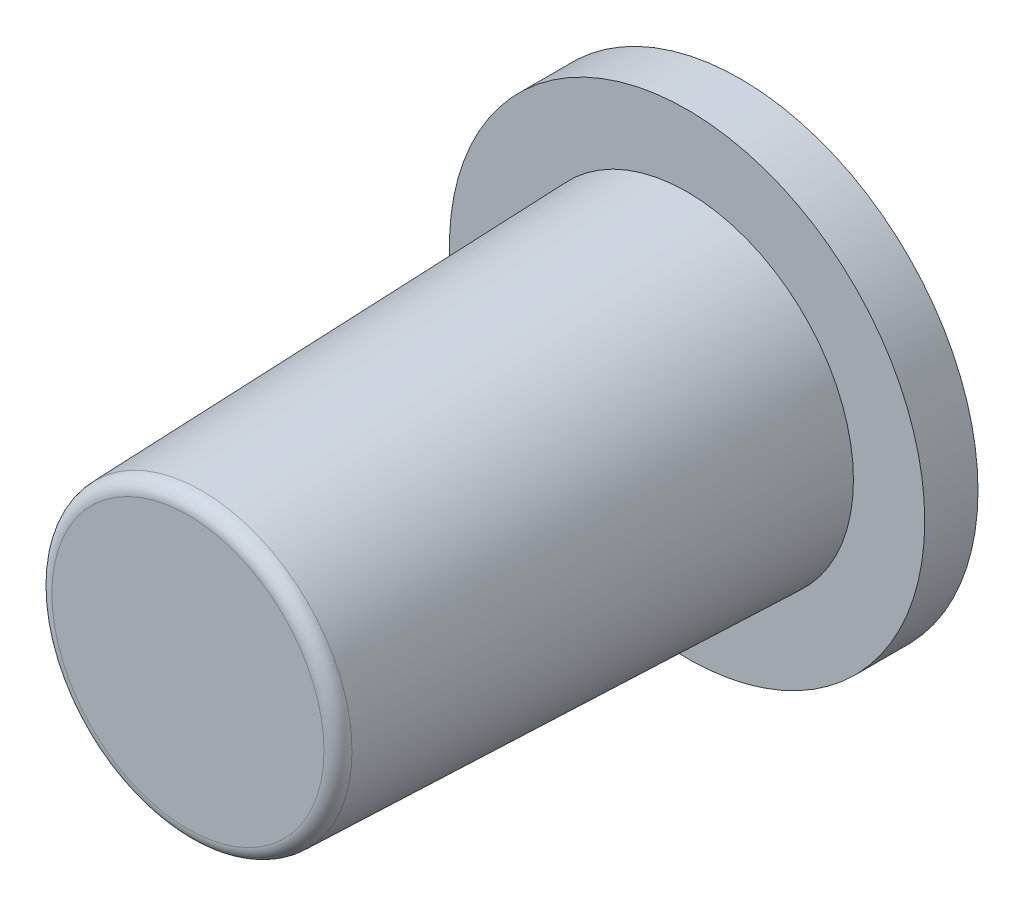
ISO-10303-21;
HEADER;
FILE_DESCRIPTION(('STEP AP214'),'2;1');
FILE_NAME('part.step','',(''),(''),'','','');
FILE_SCHEMA(('AUTOMOTIVE_DESIGN { 1 0 10303 214 1 1 1 1 }'));
ENDSEC;
DATA;
#1=APPLICATION_CONTEXT('core data for automotive mechanical design processes');
#2=APPLICATION_PROTOCOL_DEFINITION('international standard','automotive_design',2000,#1);
#3=PRODUCT_CONTEXT('',#1,'mechanical');
#4=PRODUCT('Part','Part','',(#3));
#5=PRODUCT_RELATED_PRODUCT_CATEGORY('part','',(#4));
#6=PRODUCT_DEFINITION_FORMATION('','',#4);
#7=PRODUCT_DEFINITION_CONTEXT('part definition',#1,'design');
#8=PRODUCT_DEFINITION('design','',#6,#7);
#9=PRODUCT_DEFINITION_SHAPE('','',#8);
#10=(LENGTH_UNIT() NAMED_UNIT(*) SI_UNIT(.MILLI.,.METRE.));
#11=(NAMED_UNIT(*) PLANE_ANGLE_UNIT() SI_UNIT($,.RADIAN.));
#12=(NAMED_UNIT(*) SI_UNIT($,.STERADIAN.) SOLID_ANGLE_UNIT());
#13=UNCERTAINTY_MEASURE_WITH_UNIT(LENGTH_MEASURE(1.E-05),#10,'distance_accuracy_value','');
#14=(GEOMETRIC_REPRESENTATION_CONTEXT(3) GLOBAL_UNCERTAINTY_ASSIGNED_CONTEXT((#13)) GLOBAL_UNIT_ASSIGNED_CONTEXT((#10,
#11,#12)) REPRESENTATION_CONTEXT('',''));
#15=CARTESIAN_POINT('',(0.,0.,0.));
#16=DIRECTION('',(0.,0.,1.));
#17=DIRECTION('',(1.,0.,0.));
#18=AXIS2_PLACEMENT_3D('',#15,#16,#17);
#19=CARTESIAN_POINT('',(-0.694093779186262,-0.707302140449473,0.25));
#20=DIRECTION('',(0.,0.,1.));
#21=DIRECTION('',(1.,0.,0.));
#22=AXIS2_PLACEMENT_3D('',#19,#20,#21);
#23=PLANE('',#22);
#24=DIRECTION('',(1.,0.,0.));
#25=VECTOR('',#24,1.);
#26=CARTESIAN_POINT('',(-0.694093779186262,-0.15,0.25));
#27=LINE('',#26,#25);
#28=CARTESIAN_POINT('',(-0.862046982478333,-0.15,0.25));
#29=VERTEX_POINT('',#28);
#30=CARTESIAN_POINT('',(-1.27621510726053,-0.15,0.25));
#31=VERTEX_POINT('',#30);
#32=EDGE_CURVE('E206',#29,#31,#27,.F.);
#33=ORIENTED_EDGE('',*,*,#32,.F.);
#34=CARTESIAN_POINT('',(0.,0.,0.25));
#35=DIRECTION('',(0.,0.,1.));
#36=DIRECTION('',(1.,0.,0.));
#37=AXIS2_PLACEMENT_3D('',#34,#35,#36);
#38=CIRCLE('',#37,0.875);
#39=CARTESIAN_POINT('',(-0.128714575533257,-0.865481113627151,0.25));
#40=VERTEX_POINT('',#39);
#41=EDGE_CURVE('E20',#40,#29,#38,.F.);
#42=ORIENTED_EDGE('',*,*,#41,.F.);
#43=DIRECTION('',(0.,1.,0.));
#44=VECTOR('',#43,1.);
#45=CARTESIAN_POINT('',(-0.128714575533257,-0.707302140449473,0.25));
#46=LINE('',#45,#44);
#47=CARTESIAN_POINT('',(-0.128714575533257,-1.27853727284162,0.25));
#48=VERTEX_POINT('',#47);
#49=EDGE_CURVE('E129',#48,#40,#46,.T.);
#50=ORIENTED_EDGE('',*,*,#49,.F.);
#51=CARTESIAN_POINT('',(0.,0.,0.25));
#52=DIRECTION('',(0.,0.,1.));
#53=DIRECTION('',(1.,0.,0.));
#54=AXIS2_PLACEMENT_3D('',#51,#52,#53);
#55=CIRCLE('',#54,1.285);
#56=EDGE_CURVE('E181',#48,#31,#55,.F.);
#57=ORIENTED_EDGE('',*,*,#56,.T.);
#58=EDGE_LOOP('',(#33,#42,#50,#57));
#59=FACE_BOUND('',#58,.T.);
#60=ADVANCED_FACE('F16',(#59),#23,.F.);
#61=CARTESIAN_POINT('',(0.71230296745279,-0.699011951819558,0.25));
#62=DIRECTION('',(0.,0.,1.));
#63=DIRECTION('',(1.,0.,0.));
#64=AXIS2_PLACEMENT_3D('',#61,#62,#63);
#65=PLANE('',#64);
#66=DIRECTION('',(1.,0.,0.));
#67=VECTOR('',#66,1.);
#68=CARTESIAN_POINT('',(0.71230296745279,-0.15,0.25));
#69=LINE('',#68,#67);
#70=CARTESIAN_POINT('',(1.27621510726053,-0.15,0.25));
#71=VERTEX_POINT('',#70);
#72=CARTESIAN_POINT('',(0.862046982478333,-0.15,0.25));
#73=VERTEX_POINT('',#72);
#74=EDGE_CURVE('E196',#71,#73,#69,.F.);
#75=ORIENTED_EDGE('',*,*,#74,.F.);
#76=CARTESIAN_POINT('',(0.,0.,0.25));
#77=DIRECTION('',(0.,0.,1.));
#78=DIRECTION('',(1.,0.,0.));
#79=AXIS2_PLACEMENT_3D('',#76,#77,#78);
#80=CIRCLE('',#79,1.285);
#81=CARTESIAN_POINT('',(0.171285424466742,-1.27353300050107,0.25));
#82=VERTEX_POINT('',#81);
#83=EDGE_CURVE('E173',#71,#82,#80,.F.);
#84=ORIENTED_EDGE('',*,*,#83,.T.);
#85=DIRECTION('',(0.,1.,0.));
#86=VECTOR('',#85,1.);
#87=CARTESIAN_POINT('',(0.171285424466743,-1.27353300050107,0.25));
#88=LINE('',#87,#86);
#89=CARTESIAN_POINT('',(0.171285424466743,-0.85807126939739,0.25));
#90=VERTEX_POINT('',#89);
#91=EDGE_CURVE('E207',#82,#90,#88,.T.);
#92=ORIENTED_EDGE('',*,*,#91,.T.);
#93=CARTESIAN_POINT('',(0.,0.,0.25));
#94=DIRECTION('',(0.,0.,1.));
#95=DIRECTION('',(1.,0.,0.));
#96=AXIS2_PLACEMENT_3D('',#93,#94,#95);
#97=CIRCLE('',#96,0.875);
#98=EDGE_CURVE('E178',#73,#90,#97,.F.);
#99=ORIENTED_EDGE('',*,*,#98,.F.);
#100=EDGE_LOOP('',(#75,#84,#92,#99));
#101=FACE_BOUND('',#100,.T.);
#102=ADVANCED_FACE('F493',(#101),#65,.F.);
#103=CARTESIAN_POINT('',(0.71230296745279,0.699011951819558,0.25));
#104=DIRECTION('',(0.,0.,1.));
#105=DIRECTION('',(1.,0.,0.));
#106=AXIS2_PLACEMENT_3D('',#103,#104,#105);
#107=PLANE('',#106);
#108=DIRECTION('',(1.,0.,0.));
#109=VECTOR('',#108,1.);
#110=CARTESIAN_POINT('',(0.71230296745279,0.15,0.25));
#111=LINE('',#110,#109);
#112=CARTESIAN_POINT('',(0.862046982478333,0.15,0.25));
#113=VERTEX_POINT('',#112);
#114=CARTESIAN_POINT('',(1.27621510726053,0.15,0.25));
#115=VERTEX_POINT('',#114);
#116=EDGE_CURVE('E191',#113,#115,#111,.T.);
#117=ORIENTED_EDGE('',*,*,#116,.F.);
#118=CARTESIAN_POINT('',(0.,0.,0.25));
#119=DIRECTION('',(0.,0.,1.));
#120=DIRECTION('',(1.,0.,0.));
#121=AXIS2_PLACEMENT_3D('',#118,#119,#120);
#122=CIRCLE('',#121,0.875);
#123=CARTESIAN_POINT('',(0.171285424466743,0.85807126939739,0.25));
#124=VERTEX_POINT('',#123);
#125=EDGE_CURVE('E163',#124,#113,#122,.F.);
#126=ORIENTED_EDGE('',*,*,#125,.F.);
#127=DIRECTION('',(0.,1.,0.));
#128=VECTOR('',#127,1.);
#129=CARTESIAN_POINT('',(0.171285424466743,0.85807126939739,0.25));
#130=LINE('',#129,#128);
#131=CARTESIAN_POINT('',(0.171285424466743,1.27353300050107,0.25));
#132=VERTEX_POINT('',#131);
#133=EDGE_CURVE('E167',#124,#132,#130,.T.);
#134=ORIENTED_EDGE('',*,*,#133,.T.);
#135=CARTESIAN_POINT('',(0.,0.,0.25));
#136=DIRECTION('',(0.,0.,1.));
#137=DIRECTION('',(1.,0.,0.));
#138=AXIS2_PLACEMENT_3D('',#135,#136,#137);
#139=CIRCLE('',#138,1.285);
#140=EDGE_CURVE('E168',#132,#115,#139,.F.);
#141=ORIENTED_EDGE('',*,*,#140,.T.);
#142=EDGE_LOOP('',(#117,#126,#134,#141));
#143=FACE_BOUND('',#142,.T.);
#144=ADVANCED_FACE('F485',(#143),#107,.F.);
#145=CARTESIAN_POINT('',(-0.694093779186262,0.707302140449473,0.25));
#146=DIRECTION('',(0.,0.,1.));
#147=DIRECTION('',(1.,0.,0.));
#148=AXIS2_PLACEMENT_3D('',#145,#146,#147);
#149=PLANE('',#148);
#150=DIRECTION('',(1.,0.,0.));
#151=VECTOR('',#150,1.);
#152=CARTESIAN_POINT('',(-0.694093779186262,0.15,0.25));
#153=LINE('',#152,#151);
#154=CARTESIAN_POINT('',(-1.27621510726053,0.15,0.25));
#155=VERTEX_POINT('',#154);
#156=CARTESIAN_POINT('',(-0.862046982478333,0.15,0.25));
#157=VERTEX_POINT('',#156);
#158=EDGE_CURVE('E184',#155,#157,#153,.T.);
#159=ORIENTED_EDGE('',*,*,#158,.F.);
#160=CARTESIAN_POINT('',(0.,0.,0.25));
#161=DIRECTION('',(0.,0.,1.));
#162=DIRECTION('',(1.,0.,0.));
#163=AXIS2_PLACEMENT_3D('',#160,#161,#162);
#164=CIRCLE('',#163,1.285);
#165=CARTESIAN_POINT('',(-0.128714575533257,1.27853727284162,0.25));
#166=VERTEX_POINT('',#165);
#167=EDGE_CURVE('E155',#155,#166,#164,.F.);
#168=ORIENTED_EDGE('',*,*,#167,.T.);
#169=DIRECTION('',(0.,1.,0.));
#170=VECTOR('',#169,1.);
#171=CARTESIAN_POINT('',(-0.128714575533257,1.27853727284162,0.25));
#172=LINE('',#171,#170);
#173=CARTESIAN_POINT('',(-0.128714575533257,0.865481113627151,0.25));
#174=VERTEX_POINT('',#173);
#175=EDGE_CURVE('E200',#166,#174,#172,.F.);
#176=ORIENTED_EDGE('',*,*,#175,.T.);
#177=CARTESIAN_POINT('',(0.,0.,0.25));
#178=DIRECTION('',(0.,0.,1.));
#179=DIRECTION('',(1.,0.,0.));
#180=AXIS2_PLACEMENT_3D('',#177,#178,#179);
#181=CIRCLE('',#180,0.875);
#182=EDGE_CURVE('E159',#157,#174,#181,.F.);
#183=ORIENTED_EDGE('',*,*,#182,.F.);
#184=EDGE_LOOP('',(#159,#168,#176,#183));
#185=FACE_BOUND('',#184,.T.);
#186=ADVANCED_FACE('F140',(#185),#149,.F.);
#187=CARTESIAN_POINT('',(-0.049286756828323,0.,0.249999999999999));
#188=DIRECTION('',(0.,-1.,0.));
#189=DIRECTION('',(1.,0.,0.));
#190=AXIS2_PLACEMENT_3D('',#187,#188,#189);
#191=CIRCLE('',#190,0.911333739306656);
#192=TRIMMED_CURVE('',#191,(PARAMETER_VALUE(-1.51668792221012)),
(PARAMETER_VALUE(1.51668792221012)),.T.,.PARAMETER.);
#193=CARTESIAN_POINT('',(0.,0.,0.249999999999999));
#194=DIRECTION('',(0.,0.,1.));
#195=AXIS1_PLACEMENT('',#193,#194);
#196=SURFACE_OF_REVOLUTION('',#192,#195);
#197=CARTESIAN_POINT('',(0.,0.,-0.66));
#198=VERTEX_POINT('',#197);
#199=VERTEX_LOOP('',#198);
#200=FACE_BOUND('',#199,.T.);
#201=CARTESIAN_POINT('',(0.,0.,0.));
#202=DIRECTION('',(0.,0.,1.));
#203=DIRECTION('',(1.,0.,0.));
#204=AXIS2_PLACEMENT_3D('',#201,#202,#203);
#205=CIRCLE('',#204,0.827085986014956);
#206=CARTESIAN_POINT('',(0.827085986014956,0.,0.));
#207=VERTEX_POINT('',#206);
#208=EDGE_CURVE('E143',#207,#207,#205,.T.);
#209=ORIENTED_EDGE('',*,*,#208,.F.);
#210=EDGE_LOOP('',(#209));
#211=FACE_BOUND('',#210,.T.);
#212=ADVANCED_FACE('F18',(#200,#211),#196,.T.);
#213=CARTESIAN_POINT('',(0.,0.,0.));
#214=DIRECTION('',(0.,0.,1.));
#215=DIRECTION('',(1.,0.,0.));
#216=AXIS2_PLACEMENT_3D('',#213,#214,#215);
#217=CYLINDRICAL_SURFACE('',#216,1.285);
#218=DIRECTION('',(0.,0.,-1.));
#219=VECTOR('',#218,1.);
#220=CARTESIAN_POINT('',(-0.128714575533257,-1.27853727284162,0.));
#221=LINE('',#220,#219);
#222=CARTESIAN_POINT('',(-0.128714575533257,-1.27853727284162,0.));
#223=VERTEX_POINT('',#222);
#224=EDGE_CURVE('E183',#48,#223,#221,.T.);
#225=ORIENTED_EDGE('',*,*,#224,.T.);
#226=CARTESIAN_POINT('',(0.,0.,0.));
#227=DIRECTION('',(0.,0.,1.));
#228=DIRECTION('',(1.,0.,0.));
#229=AXIS2_PLACEMENT_3D('',#226,#227,#228);
#230=CIRCLE('',#229,1.285);
#231=CARTESIAN_POINT('',(-1.27621510726053,-0.15,0.));
#232=VERTEX_POINT('',#231);
#233=EDGE_CURVE('E145',#232,#223,#230,.T.);
#234=ORIENTED_EDGE('',*,*,#233,.F.);
#235=DIRECTION('',(0.,0.,1.));
#236=VECTOR('',#235,1.);
#237=CARTESIAN_POINT('',(-1.27621510726053,-0.15,0.));
#238=LINE('',#237,#236);
#239=EDGE_CURVE('E180',#232,#31,#238,.T.);
#240=ORIENTED_EDGE('',*,*,#239,.T.);
#241=ORIENTED_EDGE('',*,*,#56,.F.);
#242=EDGE_LOOP('',(#225,#234,#240,#241));
#243=FACE_BOUND('',#242,.T.);
#244=ADVANCED_FACE('F139',(#243),#217,.F.);
#245=CARTESIAN_POINT('',(-0.128714575533257,-0.865481113627151,0.));
#246=DIRECTION('',(1.,0.,0.));
#247=DIRECTION('',(0.,0.,-1.));
#248=AXIS2_PLACEMENT_3D('',#245,#246,#247);
#249=PLANE('',#248);
#250=DIRECTION('',(0.,0.,1.));
#251=VECTOR('',#250,1.);
#252=CARTESIAN_POINT('',(-0.128714575533258,-0.865481113627151,0.));
#253=LINE('',#252,#251);
#254=CARTESIAN_POINT('',(-0.128714575533257,-0.865481113627151,0.));
#255=VERTEX_POINT('',#254);
#256=EDGE_CURVE('E189',#255,#40,#253,.T.);
#257=ORIENTED_EDGE('',*,*,#256,.F.);
#258=DIRECTION('',(0.,1.,0.));
#259=VECTOR('',#258,1.);
#260=CARTESIAN_POINT('',(-0.128714575533257,0.,0.));
#261=LINE('',#260,#259);
#262=EDGE_CURVE('E149',#223,#255,#261,.T.);
#263=ORIENTED_EDGE('',*,*,#262,.F.);
#264=ORIENTED_EDGE('',*,*,#224,.F.);
#265=ORIENTED_EDGE('',*,*,#49,.T.);
#266=EDGE_LOOP('',(#257,#263,#264,#265));
#267=FACE_BOUND('',#266,.T.);
#268=ADVANCED_FACE('F280',(#267),#249,.F.);
#269=CARTESIAN_POINT('',(0.,0.,0.));
#270=DIRECTION('',(0.,0.,1.));
#271=DIRECTION('',(1.,0.,0.));
#272=AXIS2_PLACEMENT_3D('',#269,#270,#271);
#273=CYLINDRICAL_SURFACE('',#272,0.875);
#274=CARTESIAN_POINT('',(0.,0.,0.));
#275=DIRECTION('',(0.,0.,1.));
#276=DIRECTION('',(1.,0.,0.));
#277=AXIS2_PLACEMENT_3D('',#274,#275,#276);
#278=CIRCLE('',#277,0.875);
#279=CARTESIAN_POINT('',(-0.862046982478333,-0.15,0.));
#280=VERTEX_POINT('',#279);
#281=EDGE_CURVE('E245',#255,#280,#278,.F.);
#282=ORIENTED_EDGE('',*,*,#281,.F.);
#283=ORIENTED_EDGE('',*,*,#256,.T.);
#284=ORIENTED_EDGE('',*,*,#41,.T.);
#285=DIRECTION('',(0.,0.,1.));
#286=VECTOR('',#285,1.);
#287=CARTESIAN_POINT('',(-0.862046982478333,-0.15,0.));
#288=LINE('',#287,#286);
#289=EDGE_CURVE('E271',#29,#280,#288,.F.);
#290=ORIENTED_EDGE('',*,*,#289,.T.);
#291=EDGE_LOOP('',(#282,#283,#284,#290));
#292=FACE_BOUND('',#291,.T.);
#293=ADVANCED_FACE('F273',(#292),#273,.T.);
#294=CARTESIAN_POINT('',(-1.27621510726053,-0.15,0.));
#295=DIRECTION('',(0.,1.,0.));
#296=DIRECTION('',(0.,0.,1.));
#297=AXIS2_PLACEMENT_3D('',#294,#295,#296);
#298=PLANE('',#297);
#299=ORIENTED_EDGE('',*,*,#239,.F.);
#300=DIRECTION('',(-1.,0.,0.));
#301=VECTOR('',#300,1.);
#302=CARTESIAN_POINT('',(0.,-0.15,0.));
#303=LINE('',#302,#301);
#304=EDGE_CURVE('E244',#280,#232,#303,.T.);
#305=ORIENTED_EDGE('',*,*,#304,.F.);
#306=ORIENTED_EDGE('',*,*,#289,.F.);
#307=ORIENTED_EDGE('',*,*,#32,.T.);
#308=EDGE_LOOP('',(#299,#305,#306,#307));
#309=FACE_BOUND('',#308,.T.);
#310=ADVANCED_FACE('F276',(#309),#298,.F.);
#311=CARTESIAN_POINT('',(0.,0.,0.));
#312=DIRECTION('',(0.,0.,1.));
#313=DIRECTION('',(1.,0.,0.));
#314=AXIS2_PLACEMENT_3D('',#311,#312,#313);
#315=CYLINDRICAL_SURFACE('',#314,0.875);
#316=CARTESIAN_POINT('',(0.,0.,0.));
#317=DIRECTION('',(0.,0.,1.));
#318=DIRECTION('',(1.,0.,0.));
#319=AXIS2_PLACEMENT_3D('',#316,#317,#318);
#320=CIRCLE('',#319,0.875);
#321=CARTESIAN_POINT('',(0.862046982478333,-0.15,0.));
#322=VERTEX_POINT('',#321);
#323=CARTESIAN_POINT('',(0.171285424466743,-0.85807126939739,0.));
#324=VERTEX_POINT('',#323);
#325=EDGE_CURVE('E242',#322,#324,#320,.F.);
#326=ORIENTED_EDGE('',*,*,#325,.F.);
#327=DIRECTION('',(0.,0.,1.));
#328=VECTOR('',#327,1.);
#329=CARTESIAN_POINT('',(0.862046982478333,-0.15,0.));
#330=LINE('',#329,#328);
#331=EDGE_CURVE('E172',#322,#73,#330,.T.);
#332=ORIENTED_EDGE('',*,*,#331,.T.);
#333=ORIENTED_EDGE('',*,*,#98,.T.);
#334=DIRECTION('',(0.,0.,1.));
#335=VECTOR('',#334,1.);
#336=CARTESIAN_POINT('',(0.171285424466743,-0.85807126939739,0.));
#337=LINE('',#336,#335);
#338=EDGE_CURVE('E179',#90,#324,#337,.F.);
#339=ORIENTED_EDGE('',*,*,#338,.T.);
#340=EDGE_LOOP('',(#326,#332,#333,#339));
#341=FACE_BOUND('',#340,.T.);
#342=ADVANCED_FACE('F375',(#341),#315,.T.);
#343=CARTESIAN_POINT('',(0.171285424466743,-1.27353300050107,0.));
#344=DIRECTION('',(-1.,0.,0.));
#345=DIRECTION('',(0.,0.,1.));
#346=AXIS2_PLACEMENT_3D('',#343,#344,#345);
#347=PLANE('',#346);
#348=DIRECTION('',(0.,0.,1.));
#349=VECTOR('',#348,1.);
#350=CARTESIAN_POINT('',(0.171285424466742,-1.27353300050107,0.));
#351=LINE('',#350,#349);
#352=CARTESIAN_POINT('',(0.171285424466742,-1.27353300050107,0.));
#353=VERTEX_POINT('',#352);
#354=EDGE_CURVE('E177',#82,#353,#351,.F.);
#355=ORIENTED_EDGE('',*,*,#354,.T.);
#356=DIRECTION('',(0.,1.,0.));
#357=VECTOR('',#356,1.);
#358=CARTESIAN_POINT('',(0.171285424466743,0.,0.));
#359=LINE('',#358,#357);
#360=EDGE_CURVE('E241',#324,#353,#359,.F.);
#361=ORIENTED_EDGE('',*,*,#360,.F.);
#362=ORIENTED_EDGE('',*,*,#338,.F.);
#363=ORIENTED_EDGE('',*,*,#91,.F.);
#364=EDGE_LOOP('',(#355,#361,#362,#363));
#365=FACE_BOUND('',#364,.T.);
#366=ADVANCED_FACE('F371',(#365),#347,.F.);
#367=CARTESIAN_POINT('',(0.,0.,0.));
#368=DIRECTION('',(0.,0.,1.));
#369=DIRECTION('',(1.,0.,0.));
#370=AXIS2_PLACEMENT_3D('',#367,#368,#369);
#371=CYLINDRICAL_SURFACE('',#370,1.285);
#372=DIRECTION('',(0.,0.,1.));
#373=VECTOR('',#372,1.);
#374=CARTESIAN_POINT('',(1.27621510726053,-0.15,0.));
#375=LINE('',#374,#373);
#376=CARTESIAN_POINT('',(1.27621510726053,-0.15,0.));
#377=VERTEX_POINT('',#376);
#378=EDGE_CURVE('E176',#71,#377,#375,.F.);
#379=ORIENTED_EDGE('',*,*,#378,.T.);
#380=CARTESIAN_POINT('',(0.,0.,0.));
#381=DIRECTION('',(0.,0.,1.));
#382=DIRECTION('',(1.,0.,0.));
#383=AXIS2_PLACEMENT_3D('',#380,#381,#382);
#384=CIRCLE('',#383,1.285);
#385=EDGE_CURVE('E238',#353,#377,#384,.T.);
#386=ORIENTED_EDGE('',*,*,#385,.F.);
#387=ORIENTED_EDGE('',*,*,#354,.F.);
#388=ORIENTED_EDGE('',*,*,#83,.F.);
#389=EDGE_LOOP('',(#379,#386,#387,#388));
#390=FACE_BOUND('',#389,.T.);
#391=ADVANCED_FACE('F367',(#390),#371,.F.);
#392=CARTESIAN_POINT('',(0.862046982478333,-0.15,0.));
#393=DIRECTION('',(0.,1.,0.));
#394=DIRECTION('',(0.,0.,1.));
#395=AXIS2_PLACEMENT_3D('',#392,#393,#394);
#396=PLANE('',#395);
#397=ORIENTED_EDGE('',*,*,#331,.F.);
#398=DIRECTION('',(-1.,0.,0.));
#399=VECTOR('',#398,1.);
#400=CARTESIAN_POINT('',(0.,-0.15,0.));
#401=LINE('',#400,#399);
#402=EDGE_CURVE('E237',#377,#322,#401,.T.);
#403=ORIENTED_EDGE('',*,*,#402,.F.);
#404=ORIENTED_EDGE('',*,*,#378,.F.);
#405=ORIENTED_EDGE('',*,*,#74,.T.);
#406=EDGE_LOOP('',(#397,#403,#404,#405));
#407=FACE_BOUND('',#406,.T.);
#408=ADVANCED_FACE('F363',(#407),#396,.F.);
#409=CARTESIAN_POINT('',(0.,0.,0.));
#410=DIRECTION('',(0.,0.,1.));
#411=DIRECTION('',(1.,0.,0.));
#412=AXIS2_PLACEMENT_3D('',#409,#410,#411);
#413=CYLINDRICAL_SURFACE('',#412,1.285);
#414=DIRECTION('',(0.,0.,1.));
#415=VECTOR('',#414,1.);
#416=CARTESIAN_POINT('',(0.171285424466743,1.27353300050107,0.));
#417=LINE('',#416,#415);
#418=CARTESIAN_POINT('',(0.171285424466743,1.27353300050107,0.));
#419=VERTEX_POINT('',#418);
#420=EDGE_CURVE('E171',#132,#419,#417,.F.);
#421=ORIENTED_EDGE('',*,*,#420,.T.);
#422=CARTESIAN_POINT('',(0.,0.,0.));
#423=DIRECTION('',(0.,0.,1.));
#424=DIRECTION('',(1.,0.,0.));
#425=AXIS2_PLACEMENT_3D('',#422,#423,#424);
#426=CIRCLE('',#425,1.285);
#427=CARTESIAN_POINT('',(1.27621510726053,0.15,0.));
#428=VERTEX_POINT('',#427);
#429=EDGE_CURVE('E234',#428,#419,#426,.T.);
#430=ORIENTED_EDGE('',*,*,#429,.F.);
#431=DIRECTION('',(0.,0.,-1.));
#432=VECTOR('',#431,1.);
#433=CARTESIAN_POINT('',(1.27621510726053,0.15,0.));
#434=LINE('',#433,#432);
#435=EDGE_CURVE('E162',#428,#115,#434,.F.);
#436=ORIENTED_EDGE('',*,*,#435,.T.);
#437=ORIENTED_EDGE('',*,*,#140,.F.);
#438=EDGE_LOOP('',(#421,#430,#436,#437));
#439=FACE_BOUND('',#438,.T.);
#440=ADVANCED_FACE('F359',(#439),#413,.F.);
#441=CARTESIAN_POINT('',(0.171285424466743,0.85807126939739,0.));
#442=DIRECTION('',(-1.,0.,0.));
#443=DIRECTION('',(0.,0.,1.));
#444=AXIS2_PLACEMENT_3D('',#441,#442,#443);
#445=PLANE('',#444);
#446=DIRECTION('',(0.,0.,1.));
#447=VECTOR('',#446,1.);
#448=CARTESIAN_POINT('',(0.171285424466743,0.85807126939739,0.));
#449=LINE('',#448,#447);
#450=CARTESIAN_POINT('',(0.171285424466743,0.85807126939739,0.));
#451=VERTEX_POINT('',#450);
#452=EDGE_CURVE('E166',#451,#124,#449,.T.);
#453=ORIENTED_EDGE('',*,*,#452,.F.);
#454=DIRECTION('',(0.,1.,0.));
#455=VECTOR('',#454,1.);
#456=CARTESIAN_POINT('',(0.171285424466743,0.,0.));
#457=LINE('',#456,#455);
#458=EDGE_CURVE('E233',#419,#451,#457,.F.);
#459=ORIENTED_EDGE('',*,*,#458,.F.);
#460=ORIENTED_EDGE('',*,*,#420,.F.);
#461=ORIENTED_EDGE('',*,*,#133,.F.);
#462=EDGE_LOOP('',(#453,#459,#460,#461));
#463=FACE_BOUND('',#462,.T.);
#464=ADVANCED_FACE('F355',(#463),#445,.F.);
#465=CARTESIAN_POINT('',(0.,0.,0.));
#466=DIRECTION('',(0.,0.,1.));
#467=DIRECTION('',(1.,0.,0.));
#468=AXIS2_PLACEMENT_3D('',#465,#466,#467);
#469=CYLINDRICAL_SURFACE('',#468,0.875);
#470=CARTESIAN_POINT('',(0.,0.,0.));
#471=DIRECTION('',(0.,0.,1.));
#472=DIRECTION('',(1.,0.,0.));
#473=AXIS2_PLACEMENT_3D('',#470,#471,#472);
#474=CIRCLE('',#473,0.875);
#475=CARTESIAN_POINT('',(0.862046982478333,0.15,0.));
#476=VERTEX_POINT('',#475);
#477=EDGE_CURVE('E230',#451,#476,#474,.F.);
#478=ORIENTED_EDGE('',*,*,#477,.F.);
#479=ORIENTED_EDGE('',*,*,#452,.T.);
#480=ORIENTED_EDGE('',*,*,#125,.T.);
#481=DIRECTION('',(0.,0.,-1.));
#482=VECTOR('',#481,1.);
#483=CARTESIAN_POINT('',(0.862046982478333,0.15,0.));
#484=LINE('',#483,#482);
#485=EDGE_CURVE('E259',#113,#476,#484,.T.);
#486=ORIENTED_EDGE('',*,*,#485,.T.);
#487=EDGE_LOOP('',(#478,#479,#480,#486));
#488=FACE_BOUND('',#487,.T.);
#489=ADVANCED_FACE('F351',(#488),#469,.T.);
#490=CARTESIAN_POINT('',(1.27621510726053,0.15,0.));
#491=DIRECTION('',(0.,-1.,0.));
#492=DIRECTION('',(0.,0.,-1.));
#493=AXIS2_PLACEMENT_3D('',#490,#491,#492);
#494=PLANE('',#493);
#495=ORIENTED_EDGE('',*,*,#435,.F.);
#496=DIRECTION('',(-1.,0.,0.));
#497=VECTOR('',#496,1.);
#498=CARTESIAN_POINT('',(0.,0.15,0.));
#499=LINE('',#498,#497);
#500=EDGE_CURVE('E229',#476,#428,#499,.F.);
#501=ORIENTED_EDGE('',*,*,#500,.F.);
#502=ORIENTED_EDGE('',*,*,#485,.F.);
#503=ORIENTED_EDGE('',*,*,#116,.T.);
#504=EDGE_LOOP('',(#495,#501,#502,#503));
#505=FACE_BOUND('',#504,.T.);
#506=ADVANCED_FACE('F347',(#505),#494,.F.);
#507=CARTESIAN_POINT('',(0.,0.,0.));
#508=DIRECTION('',(0.,0.,1.));
#509=DIRECTION('',(1.,0.,0.));
#510=AXIS2_PLACEMENT_3D('',#507,#508,#509);
#511=CYLINDRICAL_SURFACE('',#510,0.875);
#512=CARTESIAN_POINT('',(0.,0.,0.));
#513=DIRECTION('',(0.,0.,1.));
#514=DIRECTION('',(1.,0.,0.));
#515=AXIS2_PLACEMENT_3D('',#512,#513,#514);
#516=CIRCLE('',#515,0.875);
#517=CARTESIAN_POINT('',(-0.862046982478333,0.15,0.));
#518=VERTEX_POINT('',#517);
#519=CARTESIAN_POINT('',(-0.128714575533257,0.865481113627151,0.));
#520=VERTEX_POINT('',#519);
#521=EDGE_CURVE('E226',#518,#520,#516,.F.);
#522=ORIENTED_EDGE('',*,*,#521,.F.);
#523=DIRECTION('',(0.,0.,-1.));
#524=VECTOR('',#523,1.);
#525=CARTESIAN_POINT('',(-0.862046982478333,0.15,0.));
#526=LINE('',#525,#524);
#527=EDGE_CURVE('E146',#518,#157,#526,.F.);
#528=ORIENTED_EDGE('',*,*,#527,.T.);
#529=ORIENTED_EDGE('',*,*,#182,.T.);
#530=DIRECTION('',(0.,0.,-1.));
#531=VECTOR('',#530,1.);
#532=CARTESIAN_POINT('',(-0.128714575533257,0.865481113627151,0.));
#533=LINE('',#532,#531);
#534=EDGE_CURVE('E161',#174,#520,#533,.T.);
#535=ORIENTED_EDGE('',*,*,#534,.T.);
#536=EDGE_LOOP('',(#522,#528,#529,#535));
#537=FACE_BOUND('',#536,.T.);
#538=ADVANCED_FACE('F343',(#537),#511,.T.);
#539=CARTESIAN_POINT('',(-0.128714575533257,1.27853727284162,0.));
#540=DIRECTION('',(1.,0.,0.));
#541=DIRECTION('',(0.,0.,-1.));
#542=AXIS2_PLACEMENT_3D('',#539,#540,#541);
#543=PLANE('',#542);
#544=DIRECTION('',(0.,0.,1.));
#545=VECTOR('',#544,1.);
#546=CARTESIAN_POINT('',(-0.128714575533257,1.27853727284162,0.));
#547=LINE('',#546,#545);
#548=CARTESIAN_POINT('',(-0.128714575533257,1.27853727284162,0.));
#549=VERTEX_POINT('',#548);
#550=EDGE_CURVE('E158',#166,#549,#547,.F.);
#551=ORIENTED_EDGE('',*,*,#550,.T.);
#552=DIRECTION('',(0.,1.,0.));
#553=VECTOR('',#552,1.);
#554=CARTESIAN_POINT('',(-0.128714575533257,0.,0.));
#555=LINE('',#554,#553);
#556=EDGE_CURVE('E225',#520,#549,#555,.T.);
#557=ORIENTED_EDGE('',*,*,#556,.F.);
#558=ORIENTED_EDGE('',*,*,#534,.F.);
#559=ORIENTED_EDGE('',*,*,#175,.F.);
#560=EDGE_LOOP('',(#551,#557,#558,#559));
#561=FACE_BOUND('',#560,.T.);
#562=ADVANCED_FACE('F340',(#561),#543,.F.);
#563=CARTESIAN_POINT('',(0.,0.,0.));
#564=DIRECTION('',(0.,0.,1.));
#565=DIRECTION('',(1.,0.,0.));
#566=AXIS2_PLACEMENT_3D('',#563,#564,#565);
#567=CYLINDRICAL_SURFACE('',#566,1.285);
#568=DIRECTION('',(0.,0.,-1.));
#569=VECTOR('',#568,1.);
#570=CARTESIAN_POINT('',(-1.27621510726053,0.15,0.));
#571=LINE('',#570,#569);
#572=CARTESIAN_POINT('',(-1.27621510726053,0.15,0.));
#573=VERTEX_POINT('',#572);
#574=EDGE_CURVE('E35',#155,#573,#571,.T.);
#575=ORIENTED_EDGE('',*,*,#574,.T.);
#576=CARTESIAN_POINT('',(0.,0.,0.));
#577=DIRECTION('',(0.,0.,1.));
#578=DIRECTION('',(1.,0.,0.));
#579=AXIS2_PLACEMENT_3D('',#576,#577,#578);
#580=CIRCLE('',#579,1.285);
#581=EDGE_CURVE('E222',#549,#573,#580,.T.);
#582=ORIENTED_EDGE('',*,*,#581,.F.);
#583=ORIENTED_EDGE('',*,*,#550,.F.);
#584=ORIENTED_EDGE('',*,*,#167,.F.);
#585=EDGE_LOOP('',(#575,#582,#583,#584));
#586=FACE_BOUND('',#585,.T.);
#587=ADVANCED_FACE('F337',(#586),#567,.F.);
#588=CARTESIAN_POINT('',(-0.862046982478333,0.15,0.));
#589=DIRECTION('',(0.,-1.,0.));
#590=DIRECTION('',(0.,0.,-1.));
#591=AXIS2_PLACEMENT_3D('',#588,#589,#590);
#592=PLANE('',#591);
#593=ORIENTED_EDGE('',*,*,#527,.F.);
#594=DIRECTION('',(-1.,0.,0.));
#595=VECTOR('',#594,1.);
#596=CARTESIAN_POINT('',(0.,0.15,0.));
#597=LINE('',#596,#595);
#598=EDGE_CURVE('E221',#573,#518,#597,.F.);
#599=ORIENTED_EDGE('',*,*,#598,.F.);
#600=ORIENTED_EDGE('',*,*,#574,.F.);
#601=ORIENTED_EDGE('',*,*,#158,.T.);
#602=EDGE_LOOP('',(#593,#599,#600,#601));
#603=FACE_BOUND('',#602,.T.);
#604=ADVANCED_FACE('F333',(#603),#592,.F.);
#605=CARTESIAN_POINT('',(0.,0.,0.));
#606=DIRECTION('',(0.,0.,-1.));
#607=DIRECTION('',(-1.,0.,0.));
#608=AXIS2_PLACEMENT_3D('',#605,#606,#607);
#609=PLANE('',#608);
#610=ORIENTED_EDGE('',*,*,#581,.T.);
#611=ORIENTED_EDGE('',*,*,#598,.T.);
#612=ORIENTED_EDGE('',*,*,#521,.T.);
#613=ORIENTED_EDGE('',*,*,#556,.T.);
#614=EDGE_LOOP('',(#610,#611,#612,#613));
#615=FACE_BOUND('',#614,.T.);
#616=ORIENTED_EDGE('',*,*,#477,.T.);
#617=ORIENTED_EDGE('',*,*,#500,.T.);
#618=ORIENTED_EDGE('',*,*,#429,.T.);
#619=ORIENTED_EDGE('',*,*,#458,.T.);
#620=EDGE_LOOP('',(#616,#617,#618,#619));
#621=FACE_BOUND('',#620,.T.);
#622=ORIENTED_EDGE('',*,*,#385,.T.);
#623=ORIENTED_EDGE('',*,*,#402,.T.);
#624=ORIENTED_EDGE('',*,*,#325,.T.);
#625=ORIENTED_EDGE('',*,*,#360,.T.);
#626=EDGE_LOOP('',(#622,#623,#624,#625));
#627=FACE_BOUND('',#626,.T.);
#628=ORIENTED_EDGE('',*,*,#281,.T.);
#629=ORIENTED_EDGE('',*,*,#304,.T.);
#630=ORIENTED_EDGE('',*,*,#233,.T.);
#631=ORIENTED_EDGE('',*,*,#262,.T.);
#632=EDGE_LOOP('',(#628,#629,#630,#631));
#633=FACE_BOUND('',#632,.T.);
#634=ORIENTED_EDGE('',*,*,#208,.T.);
#635=EDGE_LOOP('',(#634));
#636=FACE_BOUND('',#635,.T.);
#637=CARTESIAN_POINT('',(0.,0.,0.));
#638=DIRECTION('',(0.,0.,1.));
#639=DIRECTION('',(1.,0.,0.));
#640=AXIS2_PLACEMENT_3D('',#637,#638,#639);
#641=CIRCLE('',#640,2.5);
#642=CARTESIAN_POINT('',(2.5,0.,0.));
#643=VERTEX_POINT('',#642);
#644=EDGE_CURVE('E218',#643,#643,#641,.T.);
#645=ORIENTED_EDGE('',*,*,#644,.F.);
#646=EDGE_LOOP('',(#645));
#647=FACE_BOUND('',#646,.T.);
#648=ADVANCED_FACE('F278',(#615,#621,#627,#633,#636,#647),#609,.T.);
#649=CARTESIAN_POINT('',(0.,0.,0.));
#650=DIRECTION('',(0.,0.,1.));
#651=DIRECTION('',(1.,0.,0.));
#652=AXIS2_PLACEMENT_3D('',#649,#650,#651);
#653=CYLINDRICAL_SURFACE('',#652,2.5);
#654=ORIENTED_EDGE('',*,*,#644,.T.);
#655=EDGE_LOOP('',(#654));
#656=FACE_BOUND('',#655,.T.);
#657=CARTESIAN_POINT('',(0.,0.,0.56));
#658=DIRECTION('',(0.,0.,1.));
#659=DIRECTION('',(1.,0.,0.));
#660=AXIS2_PLACEMENT_3D('',#657,#658,#659);
#661=CIRCLE('',#660,2.5);
#662=CARTESIAN_POINT('',(2.5,0.,0.56));
#663=VERTEX_POINT('',#662);
#664=EDGE_CURVE('E215',#663,#663,#661,.F.);
#665=ORIENTED_EDGE('',*,*,#664,.T.);
#666=EDGE_LOOP('',(#665));
#667=FACE_BOUND('',#666,.T.);
#668=ADVANCED_FACE('F327',(#656,#667),#653,.T.);
#669=CARTESIAN_POINT('',(0.,0.,5.81));
#670=DIRECTION('',(0.,0.,-1.));
#671=DIRECTION('',(-1.,0.,0.));
#672=AXIS2_PLACEMENT_3D('',#669,#670,#671);
#673=PLANE('',#672);
#674=CARTESIAN_POINT('',(0.,0.,5.81));
#675=DIRECTION('',(0.,0.,-1.));
#676=DIRECTION('',(1.,0.,0.));
#677=AXIS2_PLACEMENT_3D('',#674,#675,#676);
#678=CIRCLE('',#677,1.43073306234587);
#679=CARTESIAN_POINT('',(1.43073306234587,0.,5.81));
#680=VERTEX_POINT('',#679);
#681=EDGE_CURVE('E214',#680,#680,#678,.T.);
#682=ORIENTED_EDGE('',*,*,#681,.F.);
#683=EDGE_LOOP('',(#682));
#684=FACE_BOUND('',#683,.T.);
#685=ADVANCED_FACE('F318',(#684),#673,.F.);
#686=CARTESIAN_POINT('',(0.,0.,0.56));
#687=DIRECTION('',(0.,0.,-1.));
#688=DIRECTION('',(-1.,0.,0.));
#689=AXIS2_PLACEMENT_3D('',#686,#687,#688);
#690=PLANE('',#689);
#691=CARTESIAN_POINT('',(0.,0.,0.560000000007221));
#692=DIRECTION('',(0.,0.,-1.));
#693=DIRECTION('',(-1.,0.,0.));
#694=AXIS2_PLACEMENT_3D('',#691,#692,#693);
#695=CIRCLE('',#694,1.75000000000314);
#696=CARTESIAN_POINT('',(-1.75000000000314,0.,0.560000000007221));
#697=VERTEX_POINT('',#696);
#698=EDGE_CURVE('E26',#697,#697,#695,.F.);
#699=ORIENTED_EDGE('',*,*,#698,.F.);
#700=EDGE_LOOP('',(#699));
#701=FACE_BOUND('',#700,.T.);
#702=ORIENTED_EDGE('',*,*,#664,.F.);
#703=EDGE_LOOP('',(#702));
#704=FACE_BOUND('',#703,.T.);
#705=ADVANCED_FACE('F298',(#701,#704),#690,.F.);
#706=CARTESIAN_POINT('',(0.,0.,5.66));
#707=DIRECTION('',(0.,0.,-1.));
#708=DIRECTION('',(-1.,0.,0.));
#709=AXIS2_PLACEMENT_3D('',#706,#707,#708);
#710=TOROIDAL_SURFACE('',#709,1.43073306234587,0.15);
#711=CARTESIAN_POINT('',(0.,0.,5.66497327673687));
#712=DIRECTION('',(0.,0.,-1.));
#713=DIRECTION('',(-1.,0.,0.));
#714=AXIS2_PLACEMENT_3D('',#711,#712,#713);
#715=CIRCLE('',#714,1.58065059493495);
#716=CARTESIAN_POINT('',(-1.58065059493495,0.,5.66497327673687));
#717=VERTEX_POINT('',#716);
#718=EDGE_CURVE('E10',#717,#717,#715,.T.);
#719=ORIENTED_EDGE('',*,*,#718,.F.);
#720=EDGE_LOOP('',(#719));
#721=FACE_BOUND('',#720,.T.);
#722=ORIENTED_EDGE('',*,*,#681,.T.);
#723=EDGE_LOOP('',(#722));
#724=FACE_BOUND('',#723,.T.);
#725=ADVANCED_FACE('F292',(#721,#724),#710,.T.);
#726=CARTESIAN_POINT('',(0.,0.,0.560000000064065));
#727=DIRECTION('',(0.,0.,-1.));
#728=DIRECTION('',(-1.,0.,0.));
#729=AXIS2_PLACEMENT_3D('',#726,#727,#728);
#730=CONICAL_SURFACE('',#729,1.75000000000125,0.0331612557499843);
#731=ORIENTED_EDGE('',*,*,#718,.T.);
#732=EDGE_LOOP('',(#731));
#733=FACE_BOUND('',#732,.T.);
#734=ORIENTED_EDGE('',*,*,#698,.T.);
#735=EDGE_LOOP('',(#734));
#736=FACE_BOUND('',#735,.T.);
#737=ADVANCED_FACE('F290',(#733,#736),#730,.T.);
#738=CLOSED_SHELL('',(#60,#102,#144,#186,#212,#244,#268,#293,#310,#342,#366,#391,#408,#440,#464,
#489,#506,#538,#562,#587,#604,#648,#668,#685,#705,#725,#737));
#739=MANIFOLD_SOLID_BREP('B1',#738);
#740=ADVANCED_BREP_SHAPE_REPRESENTATION('',(#18,#739),#14);
#741=SHAPE_DEFINITION_REPRESENTATION(#9,#740);
ENDSEC;
END-ISO-10303-21;
